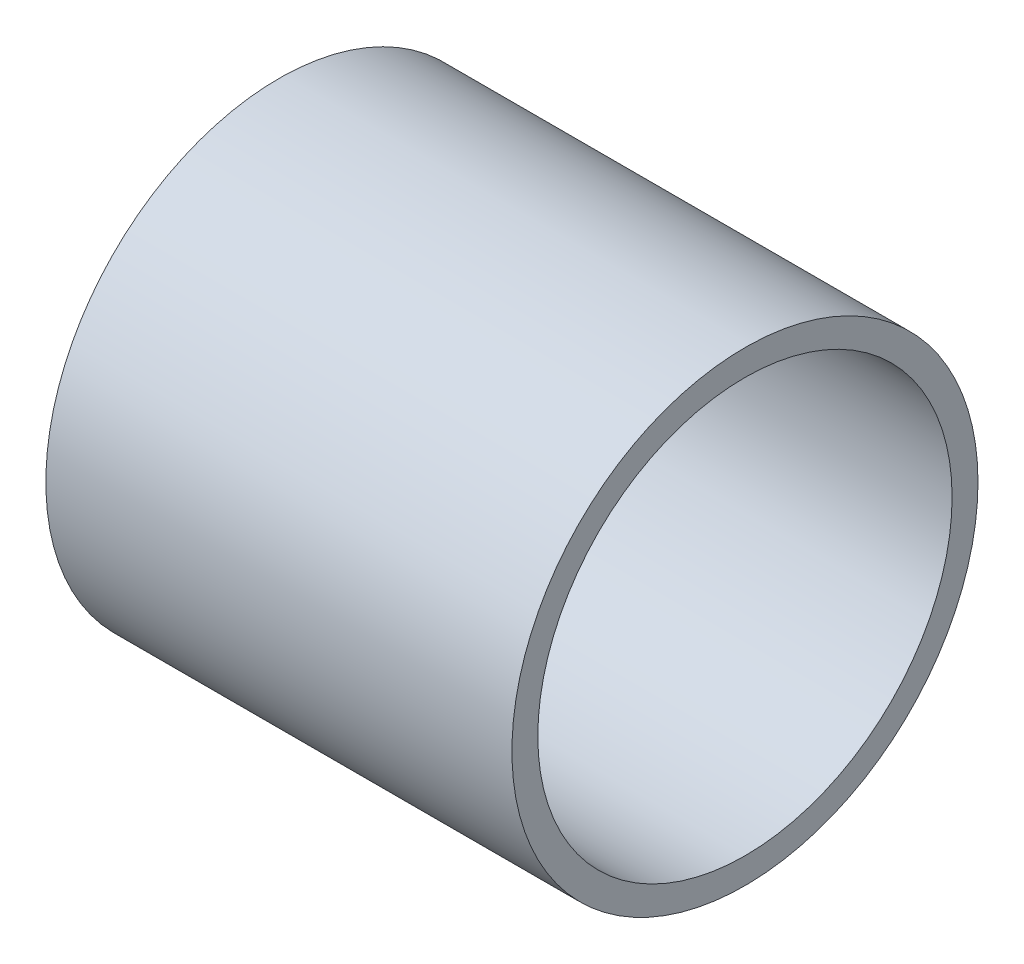
ISO-10303-21;
HEADER;
FILE_DESCRIPTION(('STEP AP214'),'2;1');
FILE_NAME('part.step','',(''),(''),'','','');
FILE_SCHEMA(('AUTOMOTIVE_DESIGN { 1 0 10303 214 1 1 1 1 }'));
ENDSEC;
DATA;
#1=APPLICATION_CONTEXT('core data for automotive mechanical design processes');
#2=APPLICATION_PROTOCOL_DEFINITION('international standard','automotive_design',2000,#1);
#3=PRODUCT_CONTEXT('',#1,'mechanical');
#4=PRODUCT('Part','Part','',(#3));
#5=PRODUCT_RELATED_PRODUCT_CATEGORY('part','',(#4));
#6=PRODUCT_DEFINITION_FORMATION('','',#4);
#7=PRODUCT_DEFINITION_CONTEXT('part definition',#1,'design');
#8=PRODUCT_DEFINITION('design','',#6,#7);
#9=PRODUCT_DEFINITION_SHAPE('','',#8);
#10=(LENGTH_UNIT() NAMED_UNIT(*) SI_UNIT(.MILLI.,.METRE.));
#11=(NAMED_UNIT(*) PLANE_ANGLE_UNIT() SI_UNIT($,.RADIAN.));
#12=(NAMED_UNIT(*) SI_UNIT($,.STERADIAN.) SOLID_ANGLE_UNIT());
#13=UNCERTAINTY_MEASURE_WITH_UNIT(LENGTH_MEASURE(1.E-05),#10,'distance_accuracy_value','');
#14=(GEOMETRIC_REPRESENTATION_CONTEXT(3) GLOBAL_UNCERTAINTY_ASSIGNED_CONTEXT((#13)) GLOBAL_UNIT_ASSIGNED_CONTEXT((#10,
#11,#12)) REPRESENTATION_CONTEXT('',''));
#15=CARTESIAN_POINT('',(0.,0.,0.));
#16=DIRECTION('',(0.,0.,1.));
#17=DIRECTION('',(1.,0.,0.));
#18=AXIS2_PLACEMENT_3D('',#15,#16,#17);
#19=CARTESIAN_POINT('',(9.,0.,0.));
#20=DIRECTION('',(-1.,0.,0.));
#21=DIRECTION('',(0.,0.,1.));
#22=AXIS2_PLACEMENT_3D('',#19,#20,#21);
#23=CYLINDRICAL_SURFACE('',#22,4.5);
#24=CARTESIAN_POINT('',(9.,0.,0.));
#25=DIRECTION('',(1.,0.,0.));
#26=DIRECTION('',(0.,0.,-1.));
#27=AXIS2_PLACEMENT_3D('',#24,#25,#26);
#28=CIRCLE('',#27,4.5);
#29=CARTESIAN_POINT('',(9.,0.,-4.5));
#30=VERTEX_POINT('',#29);
#31=EDGE_CURVE('E10',#30,#30,#28,.T.);
#32=ORIENTED_EDGE('',*,*,#31,.F.);
#33=EDGE_LOOP('',(#32));
#34=FACE_BOUND('',#33,.T.);
#35=CARTESIAN_POINT('',(0.,0.,0.));
#36=DIRECTION('',(1.,0.,0.));
#37=DIRECTION('',(0.,0.,-1.));
#38=AXIS2_PLACEMENT_3D('',#35,#36,#37);
#39=CIRCLE('',#38,4.5);
#40=CARTESIAN_POINT('',(0.,0.,-4.5));
#41=VERTEX_POINT('',#40);
#42=EDGE_CURVE('E51',#41,#41,#39,.T.);
#43=ORIENTED_EDGE('',*,*,#42,.T.);
#44=EDGE_LOOP('',(#43));
#45=FACE_BOUND('',#44,.T.);
#46=ADVANCED_FACE('F43',(#34,#45),#23,.T.);
#47=CARTESIAN_POINT('',(9.,0.,0.));
#48=DIRECTION('',(1.,0.,0.));
#49=DIRECTION('',(0.,0.,-1.));
#50=AXIS2_PLACEMENT_3D('',#47,#48,#49);
#51=PLANE('',#50);
#52=CARTESIAN_POINT('',(9.,0.,0.));
#53=DIRECTION('',(1.,0.,0.));
#54=DIRECTION('',(0.,0.,-1.));
#55=AXIS2_PLACEMENT_3D('',#52,#53,#54);
#56=CIRCLE('',#55,4.);
#57=CARTESIAN_POINT('',(9.,0.,-4.));
#58=VERTEX_POINT('',#57);
#59=EDGE_CURVE('E57',#58,#58,#56,.T.);
#60=ORIENTED_EDGE('',*,*,#59,.F.);
#61=EDGE_LOOP('',(#60));
#62=FACE_BOUND('',#61,.T.);
#63=ORIENTED_EDGE('',*,*,#31,.T.);
#64=EDGE_LOOP('',(#63));
#65=FACE_BOUND('',#64,.T.);
#66=ADVANCED_FACE('F76',(#62,#65),#51,.T.);
#67=CARTESIAN_POINT('',(0.,0.,0.));
#68=DIRECTION('',(1.,0.,0.));
#69=DIRECTION('',(0.,0.,-1.));
#70=AXIS2_PLACEMENT_3D('',#67,#68,#69);
#71=PLANE('',#70);
#72=CARTESIAN_POINT('',(0.,0.,0.));
#73=DIRECTION('',(1.,0.,0.));
#74=DIRECTION('',(0.,0.,-1.));
#75=AXIS2_PLACEMENT_3D('',#72,#73,#74);
#76=CIRCLE('',#75,4.);
#77=CARTESIAN_POINT('',(0.,0.,-4.));
#78=VERTEX_POINT('',#77);
#79=EDGE_CURVE('E46',#78,#78,#76,.T.);
#80=ORIENTED_EDGE('',*,*,#79,.T.);
#81=EDGE_LOOP('',(#80));
#82=FACE_BOUND('',#81,.T.);
#83=ORIENTED_EDGE('',*,*,#42,.F.);
#84=EDGE_LOOP('',(#83));
#85=FACE_BOUND('',#84,.T.);
#86=ADVANCED_FACE('F67',(#82,#85),#71,.F.);
#87=CARTESIAN_POINT('',(12.,0.,0.));
#88=DIRECTION('',(-1.,0.,0.));
#89=DIRECTION('',(0.,0.,1.));
#90=AXIS2_PLACEMENT_3D('',#87,#88,#89);
#91=CYLINDRICAL_SURFACE('',#90,4.);
#92=ORIENTED_EDGE('',*,*,#59,.T.);
#93=EDGE_LOOP('',(#92));
#94=FACE_BOUND('',#93,.T.);
#95=ORIENTED_EDGE('',*,*,#79,.F.);
#96=EDGE_LOOP('',(#95));
#97=FACE_BOUND('',#96,.T.);
#98=ADVANCED_FACE('F70',(#94,#97),#91,.F.);
#99=CLOSED_SHELL('',(#46,#66,#86,#98));
#100=MANIFOLD_SOLID_BREP('B2',#99);
#101=ADVANCED_BREP_SHAPE_REPRESENTATION('',(#18,#100),#14);
#102=SHAPE_DEFINITION_REPRESENTATION(#9,#101);
ENDSEC;
END-ISO-10303-21;
